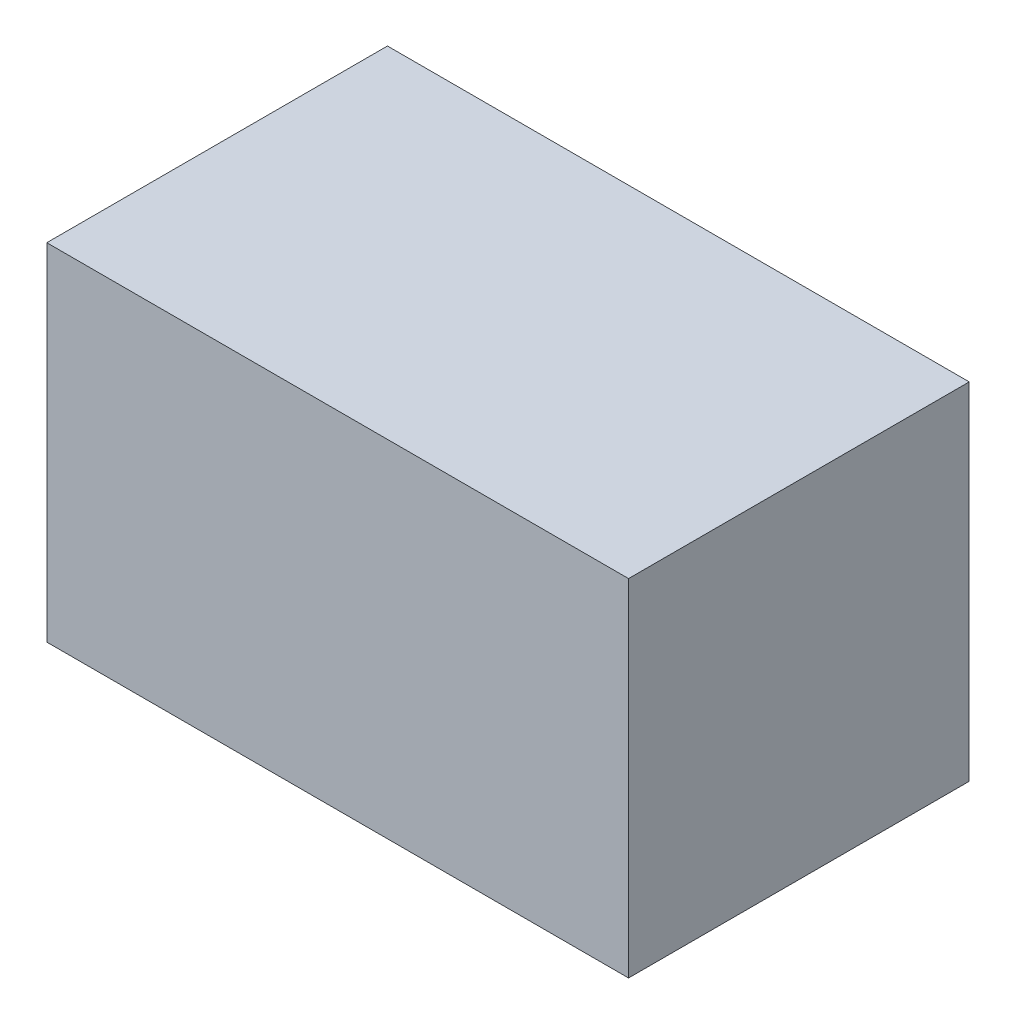
ISO-10303-21;
HEADER;
FILE_DESCRIPTION(('STEP AP214'),'2;1');
FILE_NAME('part.step','',(''),(''),'','','');
FILE_SCHEMA(('AUTOMOTIVE_DESIGN { 1 0 10303 214 1 1 1 1 }'));
ENDSEC;
DATA;
#1=APPLICATION_CONTEXT('core data for automotive mechanical design processes');
#2=APPLICATION_PROTOCOL_DEFINITION('international standard','automotive_design',2000,#1);
#3=PRODUCT_CONTEXT('',#1,'mechanical');
#4=PRODUCT('Part','Part','',(#3));
#5=PRODUCT_RELATED_PRODUCT_CATEGORY('part','',(#4));
#6=PRODUCT_DEFINITION_FORMATION('','',#4);
#7=PRODUCT_DEFINITION_CONTEXT('part definition',#1,'design');
#8=PRODUCT_DEFINITION('design','',#6,#7);
#9=PRODUCT_DEFINITION_SHAPE('','',#8);
#10=(LENGTH_UNIT() NAMED_UNIT(*) SI_UNIT(.MILLI.,.METRE.));
#11=(NAMED_UNIT(*) PLANE_ANGLE_UNIT() SI_UNIT($,.RADIAN.));
#12=(NAMED_UNIT(*) SI_UNIT($,.STERADIAN.) SOLID_ANGLE_UNIT());
#13=UNCERTAINTY_MEASURE_WITH_UNIT(LENGTH_MEASURE(1.E-05),#10,'distance_accuracy_value','');
#14=(GEOMETRIC_REPRESENTATION_CONTEXT(3) GLOBAL_UNCERTAINTY_ASSIGNED_CONTEXT((#13)) GLOBAL_UNIT_ASSIGNED_CONTEXT((#10,
#11,#12)) REPRESENTATION_CONTEXT('',''));
#15=CARTESIAN_POINT('',(0.,0.,0.));
#16=DIRECTION('',(0.,0.,1.));
#17=DIRECTION('',(1.,0.,0.));
#18=AXIS2_PLACEMENT_3D('',#15,#16,#17);
#19=CARTESIAN_POINT('',(55.5,66.,32.5));
#20=DIRECTION('',(-1.,0.,0.));
#21=DIRECTION('',(0.,0.,1.));
#22=AXIS2_PLACEMENT_3D('',#19,#20,#21);
#23=PLANE('',#22);
#24=DIRECTION('',(0.,0.,-1.));
#25=VECTOR('',#24,1.);
#26=CARTESIAN_POINT('',(55.5,0.,32.5));
#27=LINE('',#26,#25);
#28=CARTESIAN_POINT('',(55.5,0.,32.5));
#29=VERTEX_POINT('',#28);
#30=CARTESIAN_POINT('',(55.5,0.,-32.5));
#31=VERTEX_POINT('',#30);
#32=EDGE_CURVE('E107',#29,#31,#27,.T.);
#33=ORIENTED_EDGE('',*,*,#32,.T.);
#34=DIRECTION('',(0.,-1.,0.));
#35=VECTOR('',#34,1.);
#36=CARTESIAN_POINT('',(55.5,66.,-32.5));
#37=LINE('',#36,#35);
#38=CARTESIAN_POINT('',(55.5,66.,-32.5));
#39=VERTEX_POINT('',#38);
#40=EDGE_CURVE('E11',#39,#31,#37,.T.);
#41=ORIENTED_EDGE('',*,*,#40,.F.);
#42=DIRECTION('',(0.,0.,-1.));
#43=VECTOR('',#42,1.);
#44=CARTESIAN_POINT('',(55.5,66.,32.5));
#45=LINE('',#44,#43);
#46=CARTESIAN_POINT('',(55.5,66.,32.5));
#47=VERTEX_POINT('',#46);
#48=EDGE_CURVE('E91',#47,#39,#45,.T.);
#49=ORIENTED_EDGE('',*,*,#48,.F.);
#50=DIRECTION('',(0.,-1.,0.));
#51=VECTOR('',#50,1.);
#52=CARTESIAN_POINT('',(55.5,66.,32.5));
#53=LINE('',#52,#51);
#54=EDGE_CURVE('E103',#47,#29,#53,.T.);
#55=ORIENTED_EDGE('',*,*,#54,.T.);
#56=EDGE_LOOP('',(#33,#41,#49,#55));
#57=FACE_BOUND('',#56,.T.);
#58=ADVANCED_FACE('F39',(#57),#23,.F.);
#59=CARTESIAN_POINT('',(-55.5,66.,-32.5));
#60=DIRECTION('',(0.,0.,1.));
#61=DIRECTION('',(1.,0.,0.));
#62=AXIS2_PLACEMENT_3D('',#59,#60,#61);
#63=PLANE('',#62);
#64=DIRECTION('',(-1.,0.,0.));
#65=VECTOR('',#64,1.);
#66=CARTESIAN_POINT('',(-55.5,0.,-32.5));
#67=LINE('',#66,#65);
#68=CARTESIAN_POINT('',(-55.5,0.,-32.5));
#69=VERTEX_POINT('',#68);
#70=EDGE_CURVE('E96',#31,#69,#67,.T.);
#71=ORIENTED_EDGE('',*,*,#70,.T.);
#72=DIRECTION('',(0.,-1.,0.));
#73=VECTOR('',#72,1.);
#74=CARTESIAN_POINT('',(-55.5,66.,-32.5));
#75=LINE('',#74,#73);
#76=CARTESIAN_POINT('',(-55.5,66.,-32.5));
#77=VERTEX_POINT('',#76);
#78=EDGE_CURVE('E48',#77,#69,#75,.T.);
#79=ORIENTED_EDGE('',*,*,#78,.F.);
#80=DIRECTION('',(-1.,0.,0.));
#81=VECTOR('',#80,1.);
#82=CARTESIAN_POINT('',(-55.5,66.,-32.5));
#83=LINE('',#82,#81);
#84=EDGE_CURVE('E86',#39,#77,#83,.T.);
#85=ORIENTED_EDGE('',*,*,#84,.F.);
#86=ORIENTED_EDGE('',*,*,#40,.T.);
#87=EDGE_LOOP('',(#71,#79,#85,#86));
#88=FACE_BOUND('',#87,.T.);
#89=ADVANCED_FACE('F95',(#88),#63,.F.);
#90=CARTESIAN_POINT('',(-55.5,66.,32.5));
#91=DIRECTION('',(1.,0.,0.));
#92=DIRECTION('',(0.,0.,-1.));
#93=AXIS2_PLACEMENT_3D('',#90,#91,#92);
#94=PLANE('',#93);
#95=DIRECTION('',(0.,0.,1.));
#96=VECTOR('',#95,1.);
#97=CARTESIAN_POINT('',(-55.5,0.,32.5));
#98=LINE('',#97,#96);
#99=CARTESIAN_POINT('',(-55.5,0.,32.5));
#100=VERTEX_POINT('',#99);
#101=EDGE_CURVE('E73',#69,#100,#98,.T.);
#102=ORIENTED_EDGE('',*,*,#101,.T.);
#103=DIRECTION('',(0.,-1.,0.));
#104=VECTOR('',#103,1.);
#105=CARTESIAN_POINT('',(-55.5,66.,32.5));
#106=LINE('',#105,#104);
#107=CARTESIAN_POINT('',(-55.5,66.,32.5));
#108=VERTEX_POINT('',#107);
#109=EDGE_CURVE('E98',#108,#100,#106,.T.);
#110=ORIENTED_EDGE('',*,*,#109,.F.);
#111=DIRECTION('',(0.,0.,1.));
#112=VECTOR('',#111,1.);
#113=CARTESIAN_POINT('',(-55.5,66.,32.5));
#114=LINE('',#113,#112);
#115=EDGE_CURVE('E89',#77,#108,#114,.T.);
#116=ORIENTED_EDGE('',*,*,#115,.F.);
#117=ORIENTED_EDGE('',*,*,#78,.T.);
#118=EDGE_LOOP('',(#102,#110,#116,#117));
#119=FACE_BOUND('',#118,.T.);
#120=ADVANCED_FACE('F99',(#119),#94,.F.);
#121=CARTESIAN_POINT('',(-55.5,66.,32.5));
#122=DIRECTION('',(0.,0.,-1.));
#123=DIRECTION('',(-1.,0.,0.));
#124=AXIS2_PLACEMENT_3D('',#121,#122,#123);
#125=PLANE('',#124);
#126=DIRECTION('',(1.,0.,0.));
#127=VECTOR('',#126,1.);
#128=CARTESIAN_POINT('',(-55.5,0.,32.5));
#129=LINE('',#128,#127);
#130=EDGE_CURVE('E79',#100,#29,#129,.T.);
#131=ORIENTED_EDGE('',*,*,#130,.T.);
#132=ORIENTED_EDGE('',*,*,#54,.F.);
#133=DIRECTION('',(1.,0.,0.));
#134=VECTOR('',#133,1.);
#135=CARTESIAN_POINT('',(-55.5,66.,32.5));
#136=LINE('',#135,#134);
#137=EDGE_CURVE('E56',#108,#47,#136,.T.);
#138=ORIENTED_EDGE('',*,*,#137,.F.);
#139=ORIENTED_EDGE('',*,*,#109,.T.);
#140=EDGE_LOOP('',(#131,#132,#138,#139));
#141=FACE_BOUND('',#140,.T.);
#142=ADVANCED_FACE('F120',(#141),#125,.F.);
#143=CARTESIAN_POINT('',(0.,66.,0.));
#144=DIRECTION('',(0.,-1.,0.));
#145=DIRECTION('',(0.,0.,-1.));
#146=AXIS2_PLACEMENT_3D('',#143,#144,#145);
#147=PLANE('',#146);
#148=ORIENTED_EDGE('',*,*,#48,.T.);
#149=ORIENTED_EDGE('',*,*,#84,.T.);
#150=ORIENTED_EDGE('',*,*,#115,.T.);
#151=ORIENTED_EDGE('',*,*,#137,.T.);
#152=EDGE_LOOP('',(#148,#149,#150,#151));
#153=FACE_BOUND('',#152,.T.);
#154=ADVANCED_FACE('F87',(#153),#147,.F.);
#155=CARTESIAN_POINT('',(0.,0.,0.));
#156=DIRECTION('',(0.,-1.,0.));
#157=DIRECTION('',(0.,0.,-1.));
#158=AXIS2_PLACEMENT_3D('',#155,#156,#157);
#159=PLANE('',#158);
#160=ORIENTED_EDGE('',*,*,#32,.F.);
#161=ORIENTED_EDGE('',*,*,#130,.F.);
#162=ORIENTED_EDGE('',*,*,#101,.F.);
#163=ORIENTED_EDGE('',*,*,#70,.F.);
#164=EDGE_LOOP('',(#160,#161,#162,#163));
#165=FACE_BOUND('',#164,.T.);
#166=ADVANCED_FACE('F123',(#165),#159,.T.);
#167=CLOSED_SHELL('',(#58,#89,#120,#142,#154,#166));
#168=MANIFOLD_SOLID_BREP('B2',#167);
#169=ADVANCED_BREP_SHAPE_REPRESENTATION('',(#18,#168),#14);
#170=SHAPE_DEFINITION_REPRESENTATION(#9,#169);
ENDSEC;
END-ISO-10303-21;
